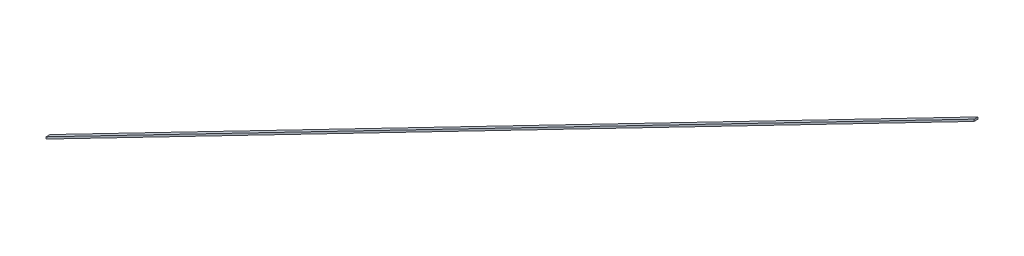
ISO-10303-21;
HEADER;
FILE_DESCRIPTION(('STEP AP214'),'2;1');
FILE_NAME('part.step','',(''),(''),'','','');
FILE_SCHEMA(('AUTOMOTIVE_DESIGN { 1 0 10303 214 1 1 1 1 }'));
ENDSEC;
DATA;
#1=APPLICATION_CONTEXT('core data for automotive mechanical design processes');
#2=APPLICATION_PROTOCOL_DEFINITION('international standard','automotive_design',2000,#1);
#3=PRODUCT_CONTEXT('',#1,'mechanical');
#4=PRODUCT('Part','Part','',(#3));
#5=PRODUCT_RELATED_PRODUCT_CATEGORY('part','',(#4));
#6=PRODUCT_DEFINITION_FORMATION('','',#4);
#7=PRODUCT_DEFINITION_CONTEXT('part definition',#1,'design');
#8=PRODUCT_DEFINITION('design','',#6,#7);
#9=PRODUCT_DEFINITION_SHAPE('','',#8);
#10=(LENGTH_UNIT() NAMED_UNIT(*) SI_UNIT(.MILLI.,.METRE.));
#11=(NAMED_UNIT(*) PLANE_ANGLE_UNIT() SI_UNIT($,.RADIAN.));
#12=(NAMED_UNIT(*) SI_UNIT($,.STERADIAN.) SOLID_ANGLE_UNIT());
#13=UNCERTAINTY_MEASURE_WITH_UNIT(LENGTH_MEASURE(1.E-05),#10,'distance_accuracy_value','');
#14=(GEOMETRIC_REPRESENTATION_CONTEXT(3) GLOBAL_UNCERTAINTY_ASSIGNED_CONTEXT((#13)) GLOBAL_UNIT_ASSIGNED_CONTEXT((#10,
#11,#12)) REPRESENTATION_CONTEXT('',''));
#15=CARTESIAN_POINT('',(0.,0.,0.));
#16=DIRECTION('',(0.,0.,1.));
#17=DIRECTION('',(1.,0.,0.));
#18=AXIS2_PLACEMENT_3D('',#15,#16,#17);
#19=CARTESIAN_POINT('',(0.,50.8,-12192.));
#20=DIRECTION('',(1.,0.,0.));
#21=DIRECTION('',(0.,0.,-1.));
#22=AXIS2_PLACEMENT_3D('',#19,#20,#21);
#23=PLANE('',#22);
#24=DIRECTION('',(0.,0.,-1.));
#25=VECTOR('',#24,1.);
#26=CARTESIAN_POINT('',(0.,4572.,-12192.));
#27=LINE('',#26,#25);
#28=CARTESIAN_POINT('',(4.7679880361686E-12,4572.,-12192.));
#29=VERTEX_POINT('',#28);
#30=CARTESIAN_POINT('',(0.,4572.,-12242.8));
#31=VERTEX_POINT('',#30);
#32=EDGE_CURVE('E43',#29,#31,#27,.T.);
#33=ORIENTED_EDGE('',*,*,#32,.F.);
#34=DIRECTION('',(0.,-1.,0.));
#35=VECTOR('',#34,1.);
#36=CARTESIAN_POINT('',(0.,50.8,-12192.));
#37=LINE('',#36,#35);
#38=CARTESIAN_POINT('',(0.,4598.23678906917,-12192.));
#39=VERTEX_POINT('',#38);
#40=EDGE_CURVE('E11',#39,#29,#37,.T.);
#41=ORIENTED_EDGE('',*,*,#40,.F.);
#42=DIRECTION('',(0.,0.,-1.));
#43=VECTOR('',#42,1.);
#44=CARTESIAN_POINT('',(0.,4598.23678906917,-26022.0350141595));
#45=LINE('',#44,#43);
#46=CARTESIAN_POINT('',(0.,4598.23678906917,-12242.8));
#47=VERTEX_POINT('',#46);
#48=EDGE_CURVE('E93',#39,#47,#45,.T.);
#49=ORIENTED_EDGE('',*,*,#48,.T.);
#50=DIRECTION('',(0.,1.,0.));
#51=VECTOR('',#50,1.);
#52=CARTESIAN_POINT('',(0.,0.,-12242.8));
#53=LINE('',#52,#51);
#54=EDGE_CURVE('E83',#31,#47,#53,.T.);
#55=ORIENTED_EDGE('',*,*,#54,.F.);
#56=EDGE_LOOP('',(#33,#41,#49,#55));
#57=FACE_BOUND('',#56,.T.);
#58=ADVANCED_FACE('F34',(#57),#23,.F.);
#59=CARTESIAN_POINT('',(4.7679880361686E-12,4572.,-12192.));
#60=DIRECTION('',(0.458883686879013,-0.888496348848055,0.));
#61=DIRECTION('',(0.888496348848055,0.458883686879013,0.));
#62=AXIS2_PLACEMENT_3D('',#59,#60,#61);
#63=PLANE('',#62);
#64=DIRECTION('',(0.888496348848055,0.458883686879013,0.));
#65=VECTOR('',#64,1.);
#66=CARTESIAN_POINT('',(-1864.07974810505,3609.25458348143,-12242.8));
#67=LINE('',#66,#65);
#68=CARTESIAN_POINT('',(12192.,10868.8293766007,-12242.8));
#69=VERTEX_POINT('',#68);
#70=EDGE_CURVE('E94',#31,#69,#67,.T.);
#71=ORIENTED_EDGE('',*,*,#70,.T.);
#72=DIRECTION('',(0.,0.,1.));
#73=VECTOR('',#72,1.);
#74=CARTESIAN_POINT('',(12192.,10868.8293766007,0.));
#75=LINE('',#74,#73);
#76=CARTESIAN_POINT('',(12192.,10868.8293766007,-12192.));
#77=VERTEX_POINT('',#76);
#78=EDGE_CURVE('E91',#69,#77,#75,.T.);
#79=ORIENTED_EDGE('',*,*,#78,.T.);
#80=DIRECTION('',(0.888496348848055,0.458883686879013,0.));
#81=VECTOR('',#80,1.);
#82=CARTESIAN_POINT('',(0.,4572.,-12192.));
#83=LINE('',#82,#81);
#84=EDGE_CURVE('E38',#29,#77,#83,.T.);
#85=ORIENTED_EDGE('',*,*,#84,.F.);
#86=ORIENTED_EDGE('',*,*,#32,.T.);
#87=EDGE_LOOP('',(#71,#79,#85,#86));
#88=FACE_BOUND('',#87,.T.);
#89=ADVANCED_FACE('F89',(#88),#63,.T.);
#90=CARTESIAN_POINT('',(12192.,10868.8293766007,-12192.));
#91=DIRECTION('',(0.,0.,1.));
#92=DIRECTION('',(1.,0.,0.));
#93=AXIS2_PLACEMENT_3D('',#90,#91,#92);
#94=PLANE('',#93);
#95=ORIENTED_EDGE('',*,*,#84,.T.);
#96=DIRECTION('',(0.,1.,0.));
#97=VECTOR('',#96,1.);
#98=CARTESIAN_POINT('',(12192.,50.8,-12192.));
#99=LINE('',#98,#97);
#100=CARTESIAN_POINT('',(12192.,10895.0661656699,-12192.));
#101=VERTEX_POINT('',#100);
#102=EDGE_CURVE('E95',#77,#101,#99,.T.);
#103=ORIENTED_EDGE('',*,*,#102,.T.);
#104=DIRECTION('',(0.888496348848055,0.458883686879013,0.));
#105=VECTOR('',#104,1.);
#106=CARTESIAN_POINT('',(-50.8,4572.,-12192.));
#107=LINE('',#106,#105);
#108=EDGE_CURVE('E59',#39,#101,#107,.T.);
#109=ORIENTED_EDGE('',*,*,#108,.F.);
#110=ORIENTED_EDGE('',*,*,#40,.T.);
#111=EDGE_LOOP('',(#95,#103,#109,#110));
#112=FACE_BOUND('',#111,.T.);
#113=ADVANCED_FACE('F78',(#112),#94,.T.);
#114=CARTESIAN_POINT('',(0.,0.,-12242.8));
#115=DIRECTION('',(0.,0.,1.));
#116=DIRECTION('',(1.,0.,0.));
#117=AXIS2_PLACEMENT_3D('',#114,#115,#116);
#118=PLANE('',#117);
#119=ORIENTED_EDGE('',*,*,#70,.F.);
#120=ORIENTED_EDGE('',*,*,#54,.T.);
#121=DIRECTION('',(0.888496348848055,0.458883686879013,0.));
#122=VECTOR('',#121,1.);
#123=CARTESIAN_POINT('',(-50.8,4572.,-12242.8));
#124=LINE('',#123,#122);
#125=CARTESIAN_POINT('',(12192.,10895.0661656699,-12242.8));
#126=VERTEX_POINT('',#125);
#127=EDGE_CURVE('E51',#47,#126,#124,.T.);
#128=ORIENTED_EDGE('',*,*,#127,.T.);
#129=DIRECTION('',(0.,-1.,0.));
#130=VECTOR('',#129,1.);
#131=CARTESIAN_POINT('',(12192.,0.,-12242.8));
#132=LINE('',#131,#130);
#133=EDGE_CURVE('E101',#126,#69,#132,.T.);
#134=ORIENTED_EDGE('',*,*,#133,.T.);
#135=EDGE_LOOP('',(#119,#120,#128,#134));
#136=FACE_BOUND('',#135,.T.);
#137=ADVANCED_FACE('F106',(#136),#118,.F.);
#138=CARTESIAN_POINT('',(12192.,50.8,0.));
#139=DIRECTION('',(-1.,0.,0.));
#140=DIRECTION('',(0.,0.,1.));
#141=AXIS2_PLACEMENT_3D('',#138,#139,#140);
#142=PLANE('',#141);
#143=ORIENTED_EDGE('',*,*,#78,.F.);
#144=ORIENTED_EDGE('',*,*,#133,.F.);
#145=DIRECTION('',(0.,0.,1.));
#146=VECTOR('',#145,1.);
#147=CARTESIAN_POINT('',(12192.,10895.0661656699,-26022.0350141595));
#148=LINE('',#147,#146);
#149=EDGE_CURVE('E87',#126,#101,#148,.T.);
#150=ORIENTED_EDGE('',*,*,#149,.T.);
#151=ORIENTED_EDGE('',*,*,#102,.F.);
#152=EDGE_LOOP('',(#143,#144,#150,#151));
#153=FACE_BOUND('',#152,.T.);
#154=ADVANCED_FACE('F108',(#153),#142,.F.);
#155=CARTESIAN_POINT('',(-50.8,4572.,-26022.0350141595));
#156=DIRECTION('',(-0.458883686879013,0.888496348848055,0.));
#157=DIRECTION('',(-0.888496348848055,-0.458883686879013,0.));
#158=AXIS2_PLACEMENT_3D('',#155,#156,#157);
#159=PLANE('',#158);
#160=ORIENTED_EDGE('',*,*,#48,.F.);
#161=ORIENTED_EDGE('',*,*,#108,.T.);
#162=ORIENTED_EDGE('',*,*,#149,.F.);
#163=ORIENTED_EDGE('',*,*,#127,.F.);
#164=EDGE_LOOP('',(#160,#161,#162,#163));
#165=FACE_BOUND('',#164,.T.);
#166=ADVANCED_FACE('F36',(#165),#159,.T.);
#167=CLOSED_SHELL('',(#58,#89,#113,#137,#154,#166));
#168=MANIFOLD_SOLID_BREP('B2',#167);
#169=ADVANCED_BREP_SHAPE_REPRESENTATION('',(#18,#168),#14);
#170=SHAPE_DEFINITION_REPRESENTATION(#9,#169);
ENDSEC;
END-ISO-10303-21;
